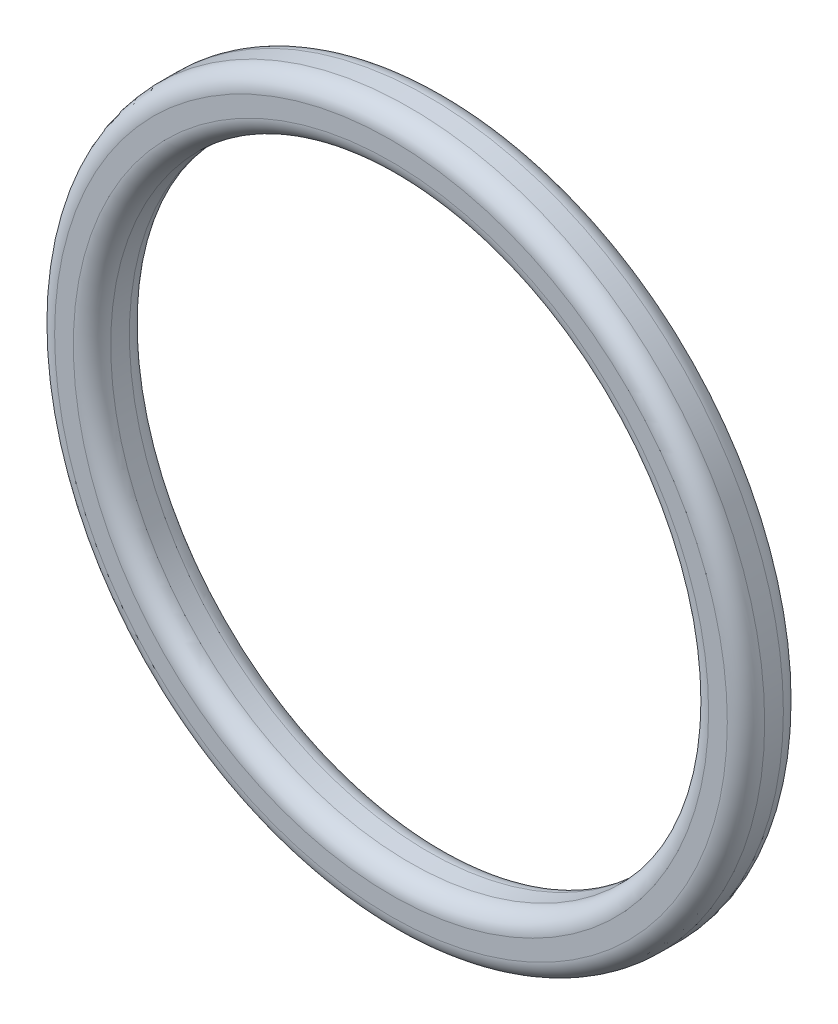
ISO-10303-21;
HEADER;
FILE_DESCRIPTION(('STEP AP214'),'2;1');
FILE_NAME('part.step','',(''),(''),'','','');
FILE_SCHEMA(('AUTOMOTIVE_DESIGN { 1 0 10303 214 1 1 1 1 }'));
ENDSEC;
DATA;
#1=APPLICATION_CONTEXT('core data for automotive mechanical design processes');
#2=APPLICATION_PROTOCOL_DEFINITION('international standard','automotive_design',2000,#1);
#3=PRODUCT_CONTEXT('',#1,'mechanical');
#4=PRODUCT('Part','Part','',(#3));
#5=PRODUCT_RELATED_PRODUCT_CATEGORY('part','',(#4));
#6=PRODUCT_DEFINITION_FORMATION('','',#4);
#7=PRODUCT_DEFINITION_CONTEXT('part definition',#1,'design');
#8=PRODUCT_DEFINITION('design','',#6,#7);
#9=PRODUCT_DEFINITION_SHAPE('','',#8);
#10=(LENGTH_UNIT() NAMED_UNIT(*) SI_UNIT(.MILLI.,.METRE.));
#11=(NAMED_UNIT(*) PLANE_ANGLE_UNIT() SI_UNIT($,.RADIAN.));
#12=(NAMED_UNIT(*) SI_UNIT($,.STERADIAN.) SOLID_ANGLE_UNIT());
#13=UNCERTAINTY_MEASURE_WITH_UNIT(LENGTH_MEASURE(1.E-05),#10,'distance_accuracy_value','');
#14=(GEOMETRIC_REPRESENTATION_CONTEXT(3) GLOBAL_UNCERTAINTY_ASSIGNED_CONTEXT((#13)) GLOBAL_UNIT_ASSIGNED_CONTEXT((#10,
#11,#12)) REPRESENTATION_CONTEXT('',''));
#15=CARTESIAN_POINT('',(0.,0.,0.));
#16=DIRECTION('',(0.,0.,1.));
#17=DIRECTION('',(1.,0.,0.));
#18=AXIS2_PLACEMENT_3D('',#15,#16,#17);
#19=CARTESIAN_POINT('',(0.,0.,1.5));
#20=DIRECTION('',(0.,0.,1.));
#21=DIRECTION('',(1.,0.,0.));
#22=AXIS2_PLACEMENT_3D('',#19,#20,#21);
#23=PLANE('',#22);
#24=CARTESIAN_POINT('',(0.,0.,1.5));
#25=DIRECTION('',(0.,0.,1.));
#26=DIRECTION('',(1.,0.,0.));
#27=AXIS2_PLACEMENT_3D('',#24,#25,#26);
#28=CIRCLE('',#27,8.5);
#29=CARTESIAN_POINT('',(8.5,0.,1.5));
#30=VERTEX_POINT('',#29);
#31=EDGE_CURVE('E10',#30,#30,#28,.F.);
#32=ORIENTED_EDGE('',*,*,#31,.T.);
#33=EDGE_LOOP('',(#32));
#34=FACE_BOUND('',#33,.T.);
#35=CARTESIAN_POINT('',(0.,0.,1.5));
#36=DIRECTION('',(0.,0.,1.));
#37=DIRECTION('',(1.,0.,0.));
#38=AXIS2_PLACEMENT_3D('',#35,#36,#37);
#39=CIRCLE('',#38,9.);
#40=CARTESIAN_POINT('',(9.,0.,1.5));
#41=VERTEX_POINT('',#40);
#42=EDGE_CURVE('E44',#41,#41,#39,.T.);
#43=ORIENTED_EDGE('',*,*,#42,.T.);
#44=EDGE_LOOP('',(#43));
#45=FACE_BOUND('',#44,.T.);
#46=ADVANCED_FACE('F36',(#34,#45),#23,.T.);
#47=CARTESIAN_POINT('',(0.,0.,0.));
#48=DIRECTION('',(0.,0.,1.));
#49=DIRECTION('',(1.,0.,0.));
#50=AXIS2_PLACEMENT_3D('',#47,#48,#49);
#51=PLANE('',#50);
#52=CARTESIAN_POINT('',(0.,0.,0.));
#53=DIRECTION('',(0.,0.,1.));
#54=DIRECTION('',(1.,0.,0.));
#55=AXIS2_PLACEMENT_3D('',#52,#53,#54);
#56=CIRCLE('',#55,8.5);
#57=CARTESIAN_POINT('',(8.5,0.,0.));
#58=VERTEX_POINT('',#57);
#59=EDGE_CURVE('E68',#58,#58,#56,.T.);
#60=ORIENTED_EDGE('',*,*,#59,.T.);
#61=EDGE_LOOP('',(#60));
#62=FACE_BOUND('',#61,.T.);
#63=CARTESIAN_POINT('',(0.,0.,0.));
#64=DIRECTION('',(0.,0.,1.));
#65=DIRECTION('',(1.,0.,0.));
#66=AXIS2_PLACEMENT_3D('',#63,#64,#65);
#67=CIRCLE('',#66,9.);
#68=CARTESIAN_POINT('',(9.,0.,0.));
#69=VERTEX_POINT('',#68);
#70=EDGE_CURVE('E72',#69,#69,#67,.F.);
#71=ORIENTED_EDGE('',*,*,#70,.T.);
#72=EDGE_LOOP('',(#71));
#73=FACE_BOUND('',#72,.T.);
#74=ADVANCED_FACE('F77',(#62,#73),#51,.F.);
#75=CARTESIAN_POINT('',(0.,0.,1.5));
#76=DIRECTION('',(0.,0.,-1.));
#77=DIRECTION('',(-1.,0.,0.));
#78=AXIS2_PLACEMENT_3D('',#75,#76,#77);
#79=CYLINDRICAL_SURFACE('',#78,9.5);
#80=CARTESIAN_POINT('',(0.,0.,0.5));
#81=DIRECTION('',(0.,0.,1.));
#82=DIRECTION('',(1.,0.,0.));
#83=AXIS2_PLACEMENT_3D('',#80,#81,#82);
#84=CIRCLE('',#83,9.5);
#85=CARTESIAN_POINT('',(9.5,0.,0.5));
#86=VERTEX_POINT('',#85);
#87=EDGE_CURVE('E49',#86,#86,#84,.T.);
#88=ORIENTED_EDGE('',*,*,#87,.T.);
#89=EDGE_LOOP('',(#88));
#90=FACE_BOUND('',#89,.T.);
#91=CARTESIAN_POINT('',(0.,0.,1.));
#92=DIRECTION('',(0.,0.,1.));
#93=DIRECTION('',(1.,0.,0.));
#94=AXIS2_PLACEMENT_3D('',#91,#92,#93);
#95=CIRCLE('',#94,9.5);
#96=CARTESIAN_POINT('',(9.5,0.,1.));
#97=VERTEX_POINT('',#96);
#98=EDGE_CURVE('E54',#97,#97,#95,.F.);
#99=ORIENTED_EDGE('',*,*,#98,.T.);
#100=EDGE_LOOP('',(#99));
#101=FACE_BOUND('',#100,.T.);
#102=ADVANCED_FACE('F87',(#90,#101),#79,.T.);
#103=CARTESIAN_POINT('',(0.,0.,1.5));
#104=DIRECTION('',(0.,0.,-1.));
#105=DIRECTION('',(-1.,0.,0.));
#106=AXIS2_PLACEMENT_3D('',#103,#104,#105);
#107=CYLINDRICAL_SURFACE('',#106,8.);
#108=CARTESIAN_POINT('',(0.,0.,0.5));
#109=DIRECTION('',(0.,0.,1.));
#110=DIRECTION('',(1.,0.,0.));
#111=AXIS2_PLACEMENT_3D('',#108,#109,#110);
#112=CIRCLE('',#111,8.);
#113=CARTESIAN_POINT('',(8.,0.,0.5));
#114=VERTEX_POINT('',#113);
#115=EDGE_CURVE('E60',#114,#114,#112,.F.);
#116=ORIENTED_EDGE('',*,*,#115,.T.);
#117=EDGE_LOOP('',(#116));
#118=FACE_BOUND('',#117,.T.);
#119=CARTESIAN_POINT('',(0.,0.,1.));
#120=DIRECTION('',(0.,0.,1.));
#121=DIRECTION('',(1.,0.,0.));
#122=AXIS2_PLACEMENT_3D('',#119,#120,#121);
#123=CIRCLE('',#122,8.);
#124=CARTESIAN_POINT('',(8.,0.,1.));
#125=VERTEX_POINT('',#124);
#126=EDGE_CURVE('E64',#125,#125,#123,.T.);
#127=ORIENTED_EDGE('',*,*,#126,.T.);
#128=EDGE_LOOP('',(#127));
#129=FACE_BOUND('',#128,.T.);
#130=ADVANCED_FACE('F90',(#118,#129),#107,.F.);
#131=CARTESIAN_POINT('',(0.,0.,0.5));
#132=DIRECTION('',(0.,0.,1.));
#133=DIRECTION('',(1.,0.,0.));
#134=AXIS2_PLACEMENT_3D('',#131,#132,#133);
#135=TOROIDAL_SURFACE('',#134,8.5,0.5);
#136=ORIENTED_EDGE('',*,*,#115,.F.);
#137=EDGE_LOOP('',(#136));
#138=FACE_BOUND('',#137,.T.);
#139=ORIENTED_EDGE('',*,*,#59,.F.);
#140=EDGE_LOOP('',(#139));
#141=FACE_BOUND('',#140,.T.);
#142=ADVANCED_FACE('F83',(#138,#141),#135,.T.);
#143=CARTESIAN_POINT('',(0.,0.,0.5));
#144=DIRECTION('',(0.,0.,1.));
#145=DIRECTION('',(1.,0.,0.));
#146=AXIS2_PLACEMENT_3D('',#143,#144,#145);
#147=TOROIDAL_SURFACE('',#146,9.,0.5);
#148=ORIENTED_EDGE('',*,*,#70,.F.);
#149=EDGE_LOOP('',(#148));
#150=FACE_BOUND('',#149,.T.);
#151=ORIENTED_EDGE('',*,*,#87,.F.);
#152=EDGE_LOOP('',(#151));
#153=FACE_BOUND('',#152,.T.);
#154=ADVANCED_FACE('F79',(#150,#153),#147,.T.);
#155=CARTESIAN_POINT('',(0.,0.,1.));
#156=DIRECTION('',(0.,0.,1.));
#157=DIRECTION('',(1.,0.,0.));
#158=AXIS2_PLACEMENT_3D('',#155,#156,#157);
#159=TOROIDAL_SURFACE('',#158,8.5,0.5);
#160=ORIENTED_EDGE('',*,*,#31,.F.);
#161=EDGE_LOOP('',(#160));
#162=FACE_BOUND('',#161,.T.);
#163=ORIENTED_EDGE('',*,*,#126,.F.);
#164=EDGE_LOOP('',(#163));
#165=FACE_BOUND('',#164,.T.);
#166=ADVANCED_FACE('F82',(#162,#165),#159,.T.);
#167=CARTESIAN_POINT('',(0.,0.,1.));
#168=DIRECTION('',(0.,0.,1.));
#169=DIRECTION('',(1.,0.,0.));
#170=AXIS2_PLACEMENT_3D('',#167,#168,#169);
#171=TOROIDAL_SURFACE('',#170,9.,0.5);
#172=ORIENTED_EDGE('',*,*,#98,.F.);
#173=EDGE_LOOP('',(#172));
#174=FACE_BOUND('',#173,.T.);
#175=ORIENTED_EDGE('',*,*,#42,.F.);
#176=EDGE_LOOP('',(#175));
#177=FACE_BOUND('',#176,.T.);
#178=ADVANCED_FACE('F38',(#174,#177),#171,.T.);
#179=CLOSED_SHELL('',(#46,#74,#102,#130,#142,#154,#166,#178));
#180=MANIFOLD_SOLID_BREP('B2',#179);
#181=ADVANCED_BREP_SHAPE_REPRESENTATION('',(#18,#180),#14);
#182=SHAPE_DEFINITION_REPRESENTATION(#9,#181);
ENDSEC;
END-ISO-10303-21;
